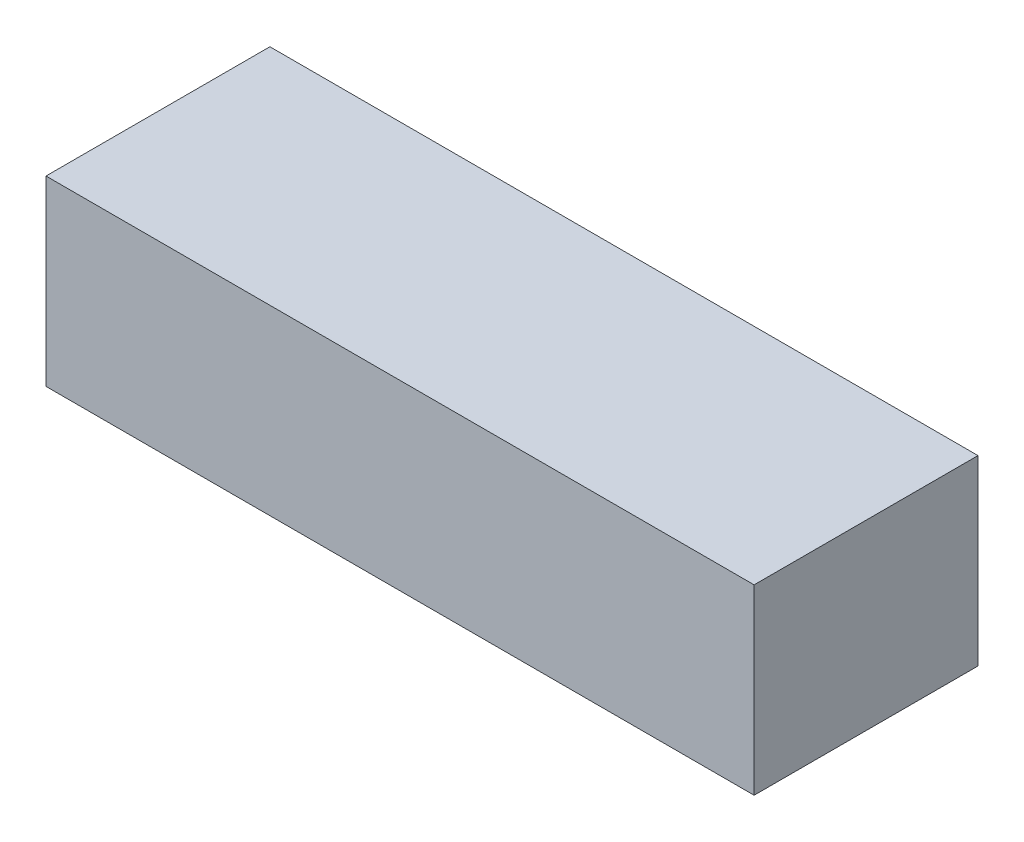
ISO-10303-21;
HEADER;
FILE_DESCRIPTION(('STEP AP214'),'2;1');
FILE_NAME('part.step','',(''),(''),'','','');
FILE_SCHEMA(('AUTOMOTIVE_DESIGN { 1 0 10303 214 1 1 1 1 }'));
ENDSEC;
DATA;
#1=APPLICATION_CONTEXT('core data for automotive mechanical design processes');
#2=APPLICATION_PROTOCOL_DEFINITION('international standard','automotive_design',2000,#1);
#3=PRODUCT_CONTEXT('',#1,'mechanical');
#4=PRODUCT('Part','Part','',(#3));
#5=PRODUCT_RELATED_PRODUCT_CATEGORY('part','',(#4));
#6=PRODUCT_DEFINITION_FORMATION('','',#4);
#7=PRODUCT_DEFINITION_CONTEXT('part definition',#1,'design');
#8=PRODUCT_DEFINITION('design','',#6,#7);
#9=PRODUCT_DEFINITION_SHAPE('','',#8);
#10=(LENGTH_UNIT() NAMED_UNIT(*) SI_UNIT(.MILLI.,.METRE.));
#11=(NAMED_UNIT(*) PLANE_ANGLE_UNIT() SI_UNIT($,.RADIAN.));
#12=(NAMED_UNIT(*) SI_UNIT($,.STERADIAN.) SOLID_ANGLE_UNIT());
#13=UNCERTAINTY_MEASURE_WITH_UNIT(LENGTH_MEASURE(1.E-05),#10,'distance_accuracy_value','');
#14=(GEOMETRIC_REPRESENTATION_CONTEXT(3) GLOBAL_UNCERTAINTY_ASSIGNED_CONTEXT((#13)) GLOBAL_UNIT_ASSIGNED_CONTEXT((#10,
#11,#12)) REPRESENTATION_CONTEXT('',''));
#15=CARTESIAN_POINT('',(0.,0.,0.));
#16=DIRECTION('',(0.,0.,1.));
#17=DIRECTION('',(1.,0.,0.));
#18=AXIS2_PLACEMENT_3D('',#15,#16,#17);
#19=CARTESIAN_POINT('',(68.,35.,-21.5));
#20=DIRECTION('',(-1.,0.,0.));
#21=DIRECTION('',(0.,0.,1.));
#22=AXIS2_PLACEMENT_3D('',#19,#20,#21);
#23=PLANE('',#22);
#24=DIRECTION('',(0.,0.,-1.));
#25=VECTOR('',#24,1.);
#26=CARTESIAN_POINT('',(68.,0.,-21.5));
#27=LINE('',#26,#25);
#28=CARTESIAN_POINT('',(68.,0.,21.5));
#29=VERTEX_POINT('',#28);
#30=CARTESIAN_POINT('',(68.,0.,-21.5));
#31=VERTEX_POINT('',#30);
#32=EDGE_CURVE('E102',#29,#31,#27,.T.);
#33=ORIENTED_EDGE('',*,*,#32,.T.);
#34=DIRECTION('',(0.,-1.,0.));
#35=VECTOR('',#34,1.);
#36=CARTESIAN_POINT('',(68.,35.,-21.5));
#37=LINE('',#36,#35);
#38=CARTESIAN_POINT('',(68.,35.,-21.5));
#39=VERTEX_POINT('',#38);
#40=EDGE_CURVE('E11',#39,#31,#37,.T.);
#41=ORIENTED_EDGE('',*,*,#40,.F.);
#42=DIRECTION('',(0.,0.,-1.));
#43=VECTOR('',#42,1.);
#44=CARTESIAN_POINT('',(68.,35.,-21.5));
#45=LINE('',#44,#43);
#46=CARTESIAN_POINT('',(68.,35.,21.5));
#47=VERTEX_POINT('',#46);
#48=EDGE_CURVE('E90',#47,#39,#45,.T.);
#49=ORIENTED_EDGE('',*,*,#48,.F.);
#50=DIRECTION('',(0.,-1.,0.));
#51=VECTOR('',#50,1.);
#52=CARTESIAN_POINT('',(68.,35.,21.5));
#53=LINE('',#52,#51);
#54=EDGE_CURVE('E98',#47,#29,#53,.T.);
#55=ORIENTED_EDGE('',*,*,#54,.T.);
#56=EDGE_LOOP('',(#33,#41,#49,#55));
#57=FACE_BOUND('',#56,.T.);
#58=ADVANCED_FACE('F39',(#57),#23,.F.);
#59=CARTESIAN_POINT('',(-68.,35.,-21.5));
#60=DIRECTION('',(0.,0.,1.));
#61=DIRECTION('',(1.,0.,0.));
#62=AXIS2_PLACEMENT_3D('',#59,#60,#61);
#63=PLANE('',#62);
#64=DIRECTION('',(-1.,0.,0.));
#65=VECTOR('',#64,1.);
#66=CARTESIAN_POINT('',(-68.,0.,-21.5));
#67=LINE('',#66,#65);
#68=CARTESIAN_POINT('',(-68.,0.,-21.5));
#69=VERTEX_POINT('',#68);
#70=EDGE_CURVE('E94',#31,#69,#67,.T.);
#71=ORIENTED_EDGE('',*,*,#70,.T.);
#72=DIRECTION('',(0.,-1.,0.));
#73=VECTOR('',#72,1.);
#74=CARTESIAN_POINT('',(-68.,35.,-21.5));
#75=LINE('',#74,#73);
#76=CARTESIAN_POINT('',(-68.,35.,-21.5));
#77=VERTEX_POINT('',#76);
#78=EDGE_CURVE('E47',#77,#69,#75,.T.);
#79=ORIENTED_EDGE('',*,*,#78,.F.);
#80=DIRECTION('',(-1.,0.,0.));
#81=VECTOR('',#80,1.);
#82=CARTESIAN_POINT('',(-68.,35.,-21.5));
#83=LINE('',#82,#81);
#84=EDGE_CURVE('E85',#39,#77,#83,.T.);
#85=ORIENTED_EDGE('',*,*,#84,.F.);
#86=ORIENTED_EDGE('',*,*,#40,.T.);
#87=EDGE_LOOP('',(#71,#79,#85,#86));
#88=FACE_BOUND('',#87,.T.);
#89=ADVANCED_FACE('F93',(#88),#63,.F.);
#90=CARTESIAN_POINT('',(-68.,35.,-21.5));
#91=DIRECTION('',(1.,0.,0.));
#92=DIRECTION('',(0.,0.,-1.));
#93=AXIS2_PLACEMENT_3D('',#90,#91,#92);
#94=PLANE('',#93);
#95=DIRECTION('',(0.,0.,1.));
#96=VECTOR('',#95,1.);
#97=CARTESIAN_POINT('',(-68.,0.,-21.5));
#98=LINE('',#97,#96);
#99=CARTESIAN_POINT('',(-68.,0.,21.5));
#100=VERTEX_POINT('',#99);
#101=EDGE_CURVE('E72',#69,#100,#98,.T.);
#102=ORIENTED_EDGE('',*,*,#101,.T.);
#103=DIRECTION('',(0.,-1.,0.));
#104=VECTOR('',#103,1.);
#105=CARTESIAN_POINT('',(-68.,35.,21.5));
#106=LINE('',#105,#104);
#107=CARTESIAN_POINT('',(-68.,35.,21.5));
#108=VERTEX_POINT('',#107);
#109=EDGE_CURVE('E95',#108,#100,#106,.T.);
#110=ORIENTED_EDGE('',*,*,#109,.F.);
#111=DIRECTION('',(0.,0.,1.));
#112=VECTOR('',#111,1.);
#113=CARTESIAN_POINT('',(-68.,35.,-21.5));
#114=LINE('',#113,#112);
#115=EDGE_CURVE('E88',#77,#108,#114,.T.);
#116=ORIENTED_EDGE('',*,*,#115,.F.);
#117=ORIENTED_EDGE('',*,*,#78,.T.);
#118=EDGE_LOOP('',(#102,#110,#116,#117));
#119=FACE_BOUND('',#118,.T.);
#120=ADVANCED_FACE('F96',(#119),#94,.F.);
#121=CARTESIAN_POINT('',(-68.,35.,21.5));
#122=DIRECTION('',(0.,0.,-1.));
#123=DIRECTION('',(-1.,0.,0.));
#124=AXIS2_PLACEMENT_3D('',#121,#122,#123);
#125=PLANE('',#124);
#126=DIRECTION('',(1.,0.,0.));
#127=VECTOR('',#126,1.);
#128=CARTESIAN_POINT('',(-68.,0.,21.5));
#129=LINE('',#128,#127);
#130=EDGE_CURVE('E78',#100,#29,#129,.T.);
#131=ORIENTED_EDGE('',*,*,#130,.T.);
#132=ORIENTED_EDGE('',*,*,#54,.F.);
#133=DIRECTION('',(1.,0.,0.));
#134=VECTOR('',#133,1.);
#135=CARTESIAN_POINT('',(-68.,35.,21.5));
#136=LINE('',#135,#134);
#137=EDGE_CURVE('E55',#108,#47,#136,.T.);
#138=ORIENTED_EDGE('',*,*,#137,.F.);
#139=ORIENTED_EDGE('',*,*,#109,.T.);
#140=EDGE_LOOP('',(#131,#132,#138,#139));
#141=FACE_BOUND('',#140,.T.);
#142=ADVANCED_FACE('F109',(#141),#125,.F.);
#143=CARTESIAN_POINT('',(0.,35.,0.));
#144=DIRECTION('',(0.,1.,0.));
#145=DIRECTION('',(0.,0.,1.));
#146=AXIS2_PLACEMENT_3D('',#143,#144,#145);
#147=PLANE('',#146);
#148=ORIENTED_EDGE('',*,*,#48,.T.);
#149=ORIENTED_EDGE('',*,*,#84,.T.);
#150=ORIENTED_EDGE('',*,*,#115,.T.);
#151=ORIENTED_EDGE('',*,*,#137,.T.);
#152=EDGE_LOOP('',(#148,#149,#150,#151));
#153=FACE_BOUND('',#152,.T.);
#154=ADVANCED_FACE('F86',(#153),#147,.T.);
#155=CARTESIAN_POINT('',(0.,0.,0.));
#156=DIRECTION('',(0.,1.,0.));
#157=DIRECTION('',(0.,0.,1.));
#158=AXIS2_PLACEMENT_3D('',#155,#156,#157);
#159=PLANE('',#158);
#160=ORIENTED_EDGE('',*,*,#32,.F.);
#161=ORIENTED_EDGE('',*,*,#130,.F.);
#162=ORIENTED_EDGE('',*,*,#101,.F.);
#163=ORIENTED_EDGE('',*,*,#70,.F.);
#164=EDGE_LOOP('',(#160,#161,#162,#163));
#165=FACE_BOUND('',#164,.T.);
#166=ADVANCED_FACE('F112',(#165),#159,.F.);
#167=CLOSED_SHELL('',(#58,#89,#120,#142,#154,#166));
#168=MANIFOLD_SOLID_BREP('B2',#167);
#169=ADVANCED_BREP_SHAPE_REPRESENTATION('',(#18,#168),#14);
#170=SHAPE_DEFINITION_REPRESENTATION(#9,#169);
ENDSEC;
END-ISO-10303-21;
